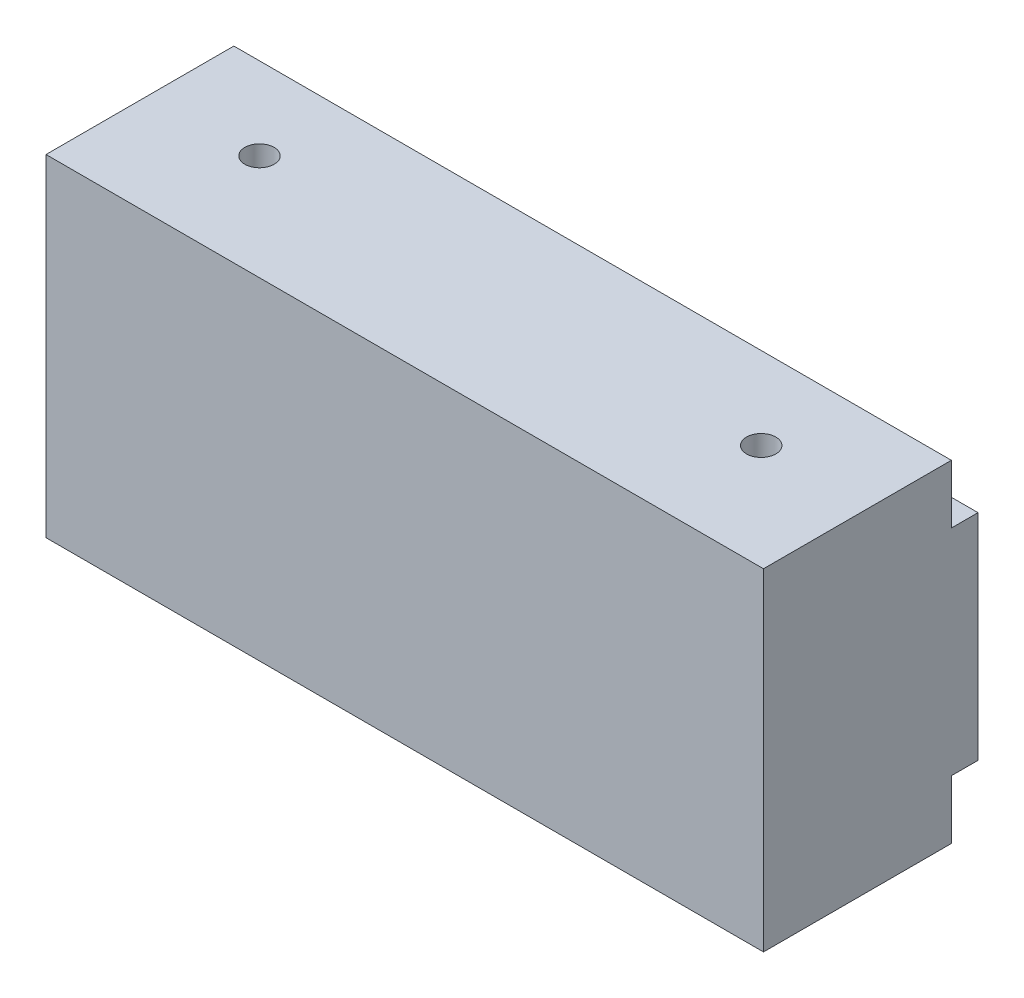
ISO-10303-21;
HEADER;
FILE_DESCRIPTION(('STEP AP214'),'2;1');
FILE_NAME('part.step','',(''),(''),'','','');
FILE_SCHEMA(('AUTOMOTIVE_DESIGN { 1 0 10303 214 1 1 1 1 }'));
ENDSEC;
DATA;
#1=APPLICATION_CONTEXT('core data for automotive mechanical design processes');
#2=APPLICATION_PROTOCOL_DEFINITION('international standard','automotive_design',2000,#1);
#3=PRODUCT_CONTEXT('',#1,'mechanical');
#4=PRODUCT('Part','Part','',(#3));
#5=PRODUCT_RELATED_PRODUCT_CATEGORY('part','',(#4));
#6=PRODUCT_DEFINITION_FORMATION('','',#4);
#7=PRODUCT_DEFINITION_CONTEXT('part definition',#1,'design');
#8=PRODUCT_DEFINITION('design','',#6,#7);
#9=PRODUCT_DEFINITION_SHAPE('','',#8);
#10=(LENGTH_UNIT() NAMED_UNIT(*) SI_UNIT(.MILLI.,.METRE.));
#11=(NAMED_UNIT(*) PLANE_ANGLE_UNIT() SI_UNIT($,.RADIAN.));
#12=(NAMED_UNIT(*) SI_UNIT($,.STERADIAN.) SOLID_ANGLE_UNIT());
#13=UNCERTAINTY_MEASURE_WITH_UNIT(LENGTH_MEASURE(1.E-05),#10,'distance_accuracy_value','');
#14=(GEOMETRIC_REPRESENTATION_CONTEXT(3) GLOBAL_UNCERTAINTY_ASSIGNED_CONTEXT((#13)) GLOBAL_UNIT_ASSIGNED_CONTEXT((#10,
#11,#12)) REPRESENTATION_CONTEXT('',''));
#15=CARTESIAN_POINT('',(0.,0.,0.));
#16=DIRECTION('',(0.,0.,1.));
#17=DIRECTION('',(1.,0.,0.));
#18=AXIS2_PLACEMENT_3D('',#15,#16,#17);
#19=CARTESIAN_POINT('',(0.,143.6878,-92.869200088));
#20=DIRECTION('',(0.,0.,1.));
#21=DIRECTION('',(1.,0.,0.));
#22=AXIS2_PLACEMENT_3D('',#19,#20,#21);
#23=PLANE('',#22);
#24=DIRECTION('',(1.,0.,0.));
#25=VECTOR('',#24,1.);
#26=CARTESIAN_POINT('',(0.,25.4,-92.869200088));
#27=LINE('',#26,#25);
#28=CARTESIAN_POINT('',(0.,25.4,-92.869200088));
#29=VERTEX_POINT('',#28);
#30=CARTESIAN_POINT('',(310.63946,25.4,-92.869200088));
#31=VERTEX_POINT('',#30);
#32=EDGE_CURVE('E125',#29,#31,#27,.T.);
#33=ORIENTED_EDGE('',*,*,#32,.F.);
#34=DIRECTION('',(0.,-1.,0.));
#35=VECTOR('',#34,1.);
#36=CARTESIAN_POINT('',(0.,143.6878,-92.869200088));
#37=LINE('',#36,#35);
#38=CARTESIAN_POINT('',(0.,118.2878,-92.869200088));
#39=VERTEX_POINT('',#38);
#40=EDGE_CURVE('E120',#39,#29,#37,.T.);
#41=ORIENTED_EDGE('',*,*,#40,.F.);
#42=DIRECTION('',(-1.,0.,0.));
#43=VECTOR('',#42,1.);
#44=CARTESIAN_POINT('',(0.,118.2878,-92.869200088));
#45=LINE('',#44,#43);
#46=CARTESIAN_POINT('',(310.63946,118.2878,-92.869200088));
#47=VERTEX_POINT('',#46);
#48=EDGE_CURVE('E46',#47,#39,#45,.T.);
#49=ORIENTED_EDGE('',*,*,#48,.F.);
#50=DIRECTION('',(0.,-1.,0.));
#51=VECTOR('',#50,1.);
#52=CARTESIAN_POINT('',(310.63946,143.6878,-92.869200088));
#53=LINE('',#52,#51);
#54=EDGE_CURVE('E167',#47,#31,#53,.T.);
#55=ORIENTED_EDGE('',*,*,#54,.T.);
#56=EDGE_LOOP('',(#33,#41,#49,#55));
#57=FACE_BOUND('',#56,.T.);
#58=ADVANCED_FACE('F38',(#57),#23,.F.);
#59=CARTESIAN_POINT('',(0.,143.6878,0.));
#60=DIRECTION('',(1.,0.,0.));
#61=DIRECTION('',(0.,0.,-1.));
#62=AXIS2_PLACEMENT_3D('',#59,#60,#61);
#63=PLANE('',#62);
#64=DIRECTION('',(0.,-1.,0.));
#65=VECTOR('',#64,1.);
#66=CARTESIAN_POINT('',(0.,25.4,-81.33842));
#67=LINE('',#66,#65);
#68=CARTESIAN_POINT('',(0.,25.4,-81.33842));
#69=VERTEX_POINT('',#68);
#70=CARTESIAN_POINT('',(0.,0.,-81.33842));
#71=VERTEX_POINT('',#70);
#72=EDGE_CURVE('E109',#69,#71,#67,.T.);
#73=ORIENTED_EDGE('',*,*,#72,.T.);
#74=DIRECTION('',(0.,0.,1.));
#75=VECTOR('',#74,1.);
#76=CARTESIAN_POINT('',(0.,0.,0.));
#77=LINE('',#76,#75);
#78=CARTESIAN_POINT('',(0.,0.,0.));
#79=VERTEX_POINT('',#78);
#80=EDGE_CURVE('E144',#71,#79,#77,.T.);
#81=ORIENTED_EDGE('',*,*,#80,.T.);
#82=DIRECTION('',(0.,-1.,0.));
#83=VECTOR('',#82,1.);
#84=CARTESIAN_POINT('',(0.,143.6878,0.));
#85=LINE('',#84,#83);
#86=CARTESIAN_POINT('',(0.,143.6878,0.));
#87=VERTEX_POINT('',#86);
#88=EDGE_CURVE('E173',#87,#79,#85,.T.);
#89=ORIENTED_EDGE('',*,*,#88,.F.);
#90=DIRECTION('',(0.,0.,1.));
#91=VECTOR('',#90,1.);
#92=CARTESIAN_POINT('',(0.,143.6878,0.));
#93=LINE('',#92,#91);
#94=CARTESIAN_POINT('',(0.,143.6878,-81.33842));
#95=VERTEX_POINT('',#94);
#96=EDGE_CURVE('E153',#95,#87,#93,.T.);
#97=ORIENTED_EDGE('',*,*,#96,.F.);
#98=DIRECTION('',(0.,1.,0.));
#99=VECTOR('',#98,1.);
#100=CARTESIAN_POINT('',(0.,118.2878,-81.33842));
#101=LINE('',#100,#99);
#102=CARTESIAN_POINT('',(0.,118.2878,-81.33842));
#103=VERTEX_POINT('',#102);
#104=EDGE_CURVE('E61',#103,#95,#101,.T.);
#105=ORIENTED_EDGE('',*,*,#104,.F.);
#106=DIRECTION('',(0.,0.,1.));
#107=VECTOR('',#106,1.);
#108=CARTESIAN_POINT('',(0.,118.2878,-94.03842));
#109=LINE('',#108,#107);
#110=EDGE_CURVE('E128',#39,#103,#109,.T.);
#111=ORIENTED_EDGE('',*,*,#110,.F.);
#112=ORIENTED_EDGE('',*,*,#40,.T.);
#113=DIRECTION('',(0.,0.,1.));
#114=VECTOR('',#113,1.);
#115=CARTESIAN_POINT('',(0.,25.4,-94.03842));
#116=LINE('',#115,#114);
#117=EDGE_CURVE('E106',#29,#69,#116,.T.);
#118=ORIENTED_EDGE('',*,*,#117,.T.);
#119=EDGE_LOOP('',(#73,#81,#89,#97,#105,#111,#112,#118));
#120=FACE_BOUND('',#119,.T.);
#121=ADVANCED_FACE('F40',(#120),#63,.F.);
#122=CARTESIAN_POINT('',(310.63946,143.6878,0.));
#123=DIRECTION('',(-1.,0.,0.));
#124=DIRECTION('',(0.,0.,1.));
#125=AXIS2_PLACEMENT_3D('',#122,#123,#124);
#126=PLANE('',#125);
#127=DIRECTION('',(0.,-1.,0.));
#128=VECTOR('',#127,1.);
#129=CARTESIAN_POINT('',(310.63946,143.6878,-81.33842));
#130=LINE('',#129,#128);
#131=CARTESIAN_POINT('',(310.63946,25.4,-81.33842));
#132=VERTEX_POINT('',#131);
#133=CARTESIAN_POINT('',(310.63946,0.,-81.33842));
#134=VERTEX_POINT('',#133);
#135=EDGE_CURVE('E53',#132,#134,#130,.T.);
#136=ORIENTED_EDGE('',*,*,#135,.F.);
#137=DIRECTION('',(0.,0.,1.));
#138=VECTOR('',#137,1.);
#139=CARTESIAN_POINT('',(310.63946,25.4,0.));
#140=LINE('',#139,#138);
#141=EDGE_CURVE('E11',#31,#132,#140,.T.);
#142=ORIENTED_EDGE('',*,*,#141,.F.);
#143=ORIENTED_EDGE('',*,*,#54,.F.);
#144=DIRECTION('',(0.,0.,-1.));
#145=VECTOR('',#144,1.);
#146=CARTESIAN_POINT('',(310.63946,118.2878,0.));
#147=LINE('',#146,#145);
#148=CARTESIAN_POINT('',(310.63946,118.2878,-81.33842));
#149=VERTEX_POINT('',#148);
#150=EDGE_CURVE('E138',#149,#47,#147,.T.);
#151=ORIENTED_EDGE('',*,*,#150,.F.);
#152=DIRECTION('',(0.,1.,0.));
#153=VECTOR('',#152,1.);
#154=CARTESIAN_POINT('',(310.63946,143.6878,-81.33842));
#155=LINE('',#154,#153);
#156=CARTESIAN_POINT('',(310.63946,143.6878,-81.33842));
#157=VERTEX_POINT('',#156);
#158=EDGE_CURVE('E135',#149,#157,#155,.T.);
#159=ORIENTED_EDGE('',*,*,#158,.T.);
#160=DIRECTION('',(0.,0.,-1.));
#161=VECTOR('',#160,1.);
#162=CARTESIAN_POINT('',(310.63946,143.6878,0.));
#163=LINE('',#162,#161);
#164=CARTESIAN_POINT('',(310.63946,143.6878,0.));
#165=VERTEX_POINT('',#164);
#166=EDGE_CURVE('E158',#165,#157,#163,.T.);
#167=ORIENTED_EDGE('',*,*,#166,.F.);
#168=DIRECTION('',(0.,-1.,0.));
#169=VECTOR('',#168,1.);
#170=CARTESIAN_POINT('',(310.63946,143.6878,0.));
#171=LINE('',#170,#169);
#172=CARTESIAN_POINT('',(310.63946,0.,0.));
#173=VERTEX_POINT('',#172);
#174=EDGE_CURVE('E170',#165,#173,#171,.T.);
#175=ORIENTED_EDGE('',*,*,#174,.T.);
#176=DIRECTION('',(0.,0.,-1.));
#177=VECTOR('',#176,1.);
#178=CARTESIAN_POINT('',(310.63946,0.,0.));
#179=LINE('',#178,#177);
#180=EDGE_CURVE('E156',#173,#134,#179,.T.);
#181=ORIENTED_EDGE('',*,*,#180,.T.);
#182=EDGE_LOOP('',(#136,#142,#143,#151,#159,#167,#175,#181));
#183=FACE_BOUND('',#182,.T.);
#184=ADVANCED_FACE('F183',(#183),#126,.F.);
#185=CARTESIAN_POINT('',(0.,0.,0.));
#186=DIRECTION('',(0.,-1.,0.));
#187=DIRECTION('',(0.,0.,-1.));
#188=AXIS2_PLACEMENT_3D('',#185,#186,#187);
#189=PLANE('',#188);
#190=CARTESIAN_POINT('',(46.7106,0.,-45.72));
#191=DIRECTION('',(0.,1.,0.));
#192=DIRECTION('',(0.,0.,1.));
#193=AXIS2_PLACEMENT_3D('',#190,#191,#192);
#194=CIRCLE('',#193,6.35);
#195=CARTESIAN_POINT('',(46.7106,0.,-39.37));
#196=VERTEX_POINT('',#195);
#197=EDGE_CURVE('E141',#196,#196,#194,.T.);
#198=ORIENTED_EDGE('',*,*,#197,.T.);
#199=EDGE_LOOP('',(#198));
#200=FACE_BOUND('',#199,.T.);
#201=CARTESIAN_POINT('',(263.92886,0.,-45.72));
#202=DIRECTION('',(0.,1.,0.));
#203=DIRECTION('',(0.,0.,-1.));
#204=AXIS2_PLACEMENT_3D('',#201,#202,#203);
#205=CIRCLE('',#204,6.35);
#206=CARTESIAN_POINT('',(263.92886,0.,-52.07));
#207=VERTEX_POINT('',#206);
#208=EDGE_CURVE('E148',#207,#207,#205,.T.);
#209=ORIENTED_EDGE('',*,*,#208,.T.);
#210=EDGE_LOOP('',(#209));
#211=FACE_BOUND('',#210,.T.);
#212=ORIENTED_EDGE('',*,*,#80,.F.);
#213=DIRECTION('',(1.,0.,0.));
#214=VECTOR('',#213,1.);
#215=CARTESIAN_POINT('',(0.,0.,-81.33842));
#216=LINE('',#215,#214);
#217=EDGE_CURVE('E113',#71,#134,#216,.T.);
#218=ORIENTED_EDGE('',*,*,#217,.T.);
#219=ORIENTED_EDGE('',*,*,#180,.F.);
#220=DIRECTION('',(1.,0.,0.));
#221=VECTOR('',#220,1.);
#222=CARTESIAN_POINT('',(0.,0.,0.));
#223=LINE('',#222,#221);
#224=EDGE_CURVE('E162',#79,#173,#223,.T.);
#225=ORIENTED_EDGE('',*,*,#224,.F.);
#226=EDGE_LOOP('',(#212,#218,#219,#225));
#227=FACE_BOUND('',#226,.T.);
#228=ADVANCED_FACE('F189',(#200,#211,#227),#189,.T.);
#229=CARTESIAN_POINT('',(0.,143.6878,0.));
#230=DIRECTION('',(0.,0.,-1.));
#231=DIRECTION('',(-1.,0.,0.));
#232=AXIS2_PLACEMENT_3D('',#229,#230,#231);
#233=PLANE('',#232);
#234=ORIENTED_EDGE('',*,*,#224,.T.);
#235=ORIENTED_EDGE('',*,*,#174,.F.);
#236=DIRECTION('',(1.,0.,0.));
#237=VECTOR('',#236,1.);
#238=CARTESIAN_POINT('',(0.,143.6878,0.));
#239=LINE('',#238,#237);
#240=EDGE_CURVE('E155',#87,#165,#239,.T.);
#241=ORIENTED_EDGE('',*,*,#240,.F.);
#242=ORIENTED_EDGE('',*,*,#88,.T.);
#243=EDGE_LOOP('',(#234,#235,#241,#242));
#244=FACE_BOUND('',#243,.T.);
#245=ADVANCED_FACE('F193',(#244),#233,.F.);
#246=CARTESIAN_POINT('',(0.,143.6878,0.));
#247=DIRECTION('',(0.,-1.,0.));
#248=DIRECTION('',(0.,0.,-1.));
#249=AXIS2_PLACEMENT_3D('',#246,#247,#248);
#250=PLANE('',#249);
#251=CARTESIAN_POINT('',(46.7106,143.6878,-45.72));
#252=DIRECTION('',(0.,1.,0.));
#253=DIRECTION('',(0.,0.,1.));
#254=AXIS2_PLACEMENT_3D('',#251,#252,#253);
#255=CIRCLE('',#254,6.35);
#256=CARTESIAN_POINT('',(46.7106,143.6878,-39.37));
#257=VERTEX_POINT('',#256);
#258=EDGE_CURVE('E145',#257,#257,#255,.T.);
#259=ORIENTED_EDGE('',*,*,#258,.F.);
#260=EDGE_LOOP('',(#259));
#261=FACE_BOUND('',#260,.T.);
#262=CARTESIAN_POINT('',(263.92886,143.6878,-45.72));
#263=DIRECTION('',(0.,1.,0.));
#264=DIRECTION('',(0.,0.,-1.));
#265=AXIS2_PLACEMENT_3D('',#262,#263,#264);
#266=CIRCLE('',#265,6.35);
#267=CARTESIAN_POINT('',(263.92886,143.6878,-52.07));
#268=VERTEX_POINT('',#267);
#269=EDGE_CURVE('E140',#268,#268,#266,.T.);
#270=ORIENTED_EDGE('',*,*,#269,.F.);
#271=EDGE_LOOP('',(#270));
#272=FACE_BOUND('',#271,.T.);
#273=ORIENTED_EDGE('',*,*,#166,.T.);
#274=DIRECTION('',(1.,0.,0.));
#275=VECTOR('',#274,1.);
#276=CARTESIAN_POINT('',(0.,143.6878,-81.33842));
#277=LINE('',#276,#275);
#278=EDGE_CURVE('E127',#95,#157,#277,.T.);
#279=ORIENTED_EDGE('',*,*,#278,.F.);
#280=ORIENTED_EDGE('',*,*,#96,.T.);
#281=ORIENTED_EDGE('',*,*,#240,.T.);
#282=EDGE_LOOP('',(#273,#279,#280,#281));
#283=FACE_BOUND('',#282,.T.);
#284=ADVANCED_FACE('F195',(#261,#272,#283),#250,.F.);
#285=CARTESIAN_POINT('',(263.92886,0.,-45.72));
#286=DIRECTION('',(0.,1.,0.));
#287=DIRECTION('',(0.,0.,1.));
#288=AXIS2_PLACEMENT_3D('',#285,#286,#287);
#289=CYLINDRICAL_SURFACE('',#288,6.35);
#290=ORIENTED_EDGE('',*,*,#208,.F.);
#291=EDGE_LOOP('',(#290));
#292=FACE_BOUND('',#291,.T.);
#293=ORIENTED_EDGE('',*,*,#269,.T.);
#294=EDGE_LOOP('',(#293));
#295=FACE_BOUND('',#294,.T.);
#296=ADVANCED_FACE('F221',(#292,#295),#289,.F.);
#297=CARTESIAN_POINT('',(46.7106,0.,-45.72));
#298=DIRECTION('',(0.,1.,0.));
#299=DIRECTION('',(0.,0.,1.));
#300=AXIS2_PLACEMENT_3D('',#297,#298,#299);
#301=CYLINDRICAL_SURFACE('',#300,6.35);
#302=ORIENTED_EDGE('',*,*,#197,.F.);
#303=EDGE_LOOP('',(#302));
#304=FACE_BOUND('',#303,.T.);
#305=ORIENTED_EDGE('',*,*,#258,.T.);
#306=EDGE_LOOP('',(#305));
#307=FACE_BOUND('',#306,.T.);
#308=ADVANCED_FACE('F204',(#304,#307),#301,.F.);
#309=CARTESIAN_POINT('',(0.,118.2878,0.));
#310=DIRECTION('',(0.,1.,0.));
#311=DIRECTION('',(0.,0.,1.));
#312=AXIS2_PLACEMENT_3D('',#309,#310,#311);
#313=PLANE('',#312);
#314=ORIENTED_EDGE('',*,*,#150,.T.);
#315=ORIENTED_EDGE('',*,*,#48,.T.);
#316=ORIENTED_EDGE('',*,*,#110,.T.);
#317=DIRECTION('',(1.,0.,0.));
#318=VECTOR('',#317,1.);
#319=CARTESIAN_POINT('',(0.,118.2878,-81.33842));
#320=LINE('',#319,#318);
#321=EDGE_CURVE('E130',#103,#149,#320,.T.);
#322=ORIENTED_EDGE('',*,*,#321,.T.);
#323=EDGE_LOOP('',(#314,#315,#316,#322));
#324=FACE_BOUND('',#323,.T.);
#325=ADVANCED_FACE('F177',(#324),#313,.T.);
#326=CARTESIAN_POINT('',(0.,118.2878,-81.33842));
#327=DIRECTION('',(0.,0.,1.));
#328=DIRECTION('',(1.,0.,0.));
#329=AXIS2_PLACEMENT_3D('',#326,#327,#328);
#330=PLANE('',#329);
#331=ORIENTED_EDGE('',*,*,#321,.F.);
#332=ORIENTED_EDGE('',*,*,#104,.T.);
#333=ORIENTED_EDGE('',*,*,#278,.T.);
#334=ORIENTED_EDGE('',*,*,#158,.F.);
#335=EDGE_LOOP('',(#331,#332,#333,#334));
#336=FACE_BOUND('',#335,.T.);
#337=ADVANCED_FACE('F196',(#336),#330,.F.);
#338=CARTESIAN_POINT('',(0.,25.4,0.));
#339=DIRECTION('',(0.,-1.,0.));
#340=DIRECTION('',(0.,0.,1.));
#341=AXIS2_PLACEMENT_3D('',#338,#339,#340);
#342=PLANE('',#341);
#343=ORIENTED_EDGE('',*,*,#32,.T.);
#344=ORIENTED_EDGE('',*,*,#141,.T.);
#345=DIRECTION('',(1.,0.,0.));
#346=VECTOR('',#345,1.);
#347=CARTESIAN_POINT('',(0.,25.4,-81.33842));
#348=LINE('',#347,#346);
#349=EDGE_CURVE('E102',#69,#132,#348,.T.);
#350=ORIENTED_EDGE('',*,*,#349,.F.);
#351=ORIENTED_EDGE('',*,*,#117,.F.);
#352=EDGE_LOOP('',(#343,#344,#350,#351));
#353=FACE_BOUND('',#352,.T.);
#354=ADVANCED_FACE('F104',(#353),#342,.T.);
#355=CARTESIAN_POINT('',(0.,25.4,-81.33842));
#356=DIRECTION('',(0.,0.,-1.));
#357=DIRECTION('',(-1.,0.,0.));
#358=AXIS2_PLACEMENT_3D('',#355,#356,#357);
#359=PLANE('',#358);
#360=ORIENTED_EDGE('',*,*,#135,.T.);
#361=ORIENTED_EDGE('',*,*,#217,.F.);
#362=ORIENTED_EDGE('',*,*,#72,.F.);
#363=ORIENTED_EDGE('',*,*,#349,.T.);
#364=EDGE_LOOP('',(#360,#361,#362,#363));
#365=FACE_BOUND('',#364,.T.);
#366=ADVANCED_FACE('F112',(#365),#359,.T.);
#367=CLOSED_SHELL('',(#58,#121,#184,#228,#245,#284,#296,#308,#325,#337,#354,#366));
#368=MANIFOLD_SOLID_BREP('B2',#367);
#369=ADVANCED_BREP_SHAPE_REPRESENTATION('',(#18,#368),#14);
#370=SHAPE_DEFINITION_REPRESENTATION(#9,#369);
ENDSEC;
END-ISO-10303-21;
